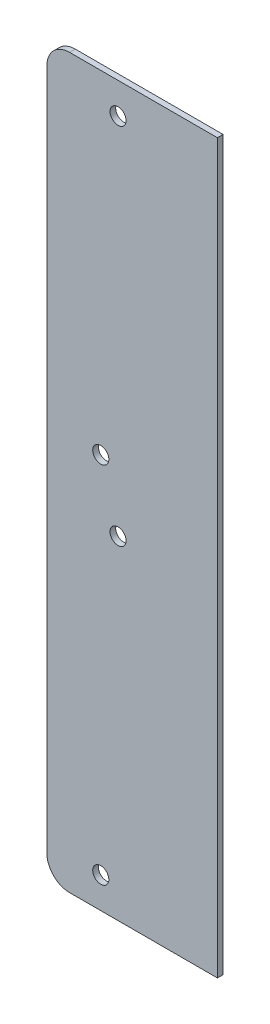
ISO-10303-21;
HEADER;
FILE_DESCRIPTION(('STEP AP214'),'2;1');
FILE_NAME('part.step','',(''),(''),'','','');
FILE_SCHEMA(('AUTOMOTIVE_DESIGN { 1 0 10303 214 1 1 1 1 }'));
ENDSEC;
DATA;
#1=APPLICATION_CONTEXT('core data for automotive mechanical design processes');
#2=APPLICATION_PROTOCOL_DEFINITION('international standard','automotive_design',2000,#1);
#3=PRODUCT_CONTEXT('',#1,'mechanical');
#4=PRODUCT('Part','Part','',(#3));
#5=PRODUCT_RELATED_PRODUCT_CATEGORY('part','',(#4));
#6=PRODUCT_DEFINITION_FORMATION('','',#4);
#7=PRODUCT_DEFINITION_CONTEXT('part definition',#1,'design');
#8=PRODUCT_DEFINITION('design','',#6,#7);
#9=PRODUCT_DEFINITION_SHAPE('','',#8);
#10=(LENGTH_UNIT() NAMED_UNIT(*) SI_UNIT(.MILLI.,.METRE.));
#11=(NAMED_UNIT(*) PLANE_ANGLE_UNIT() SI_UNIT($,.RADIAN.));
#12=(NAMED_UNIT(*) SI_UNIT($,.STERADIAN.) SOLID_ANGLE_UNIT());
#13=UNCERTAINTY_MEASURE_WITH_UNIT(LENGTH_MEASURE(1.E-05),#10,'distance_accuracy_value','');
#14=(GEOMETRIC_REPRESENTATION_CONTEXT(3) GLOBAL_UNCERTAINTY_ASSIGNED_CONTEXT((#13)) GLOBAL_UNIT_ASSIGNED_CONTEXT((#10,
#11,#12)) REPRESENTATION_CONTEXT('',''));
#15=CARTESIAN_POINT('',(0.,0.,0.));
#16=DIRECTION('',(0.,0.,1.));
#17=DIRECTION('',(1.,0.,0.));
#18=AXIS2_PLACEMENT_3D('',#15,#16,#17);
#19=CARTESIAN_POINT('',(-17.4625,50.8,1.5875));
#20=DIRECTION('',(1.,0.,0.));
#21=DIRECTION('',(0.,1.,0.));
#22=AXIS2_PLACEMENT_3D('',#19,#20,#21);
#23=PLANE('',#22);
#24=DIRECTION('',(0.,-1.,0.));
#25=VECTOR('',#24,1.);
#26=CARTESIAN_POINT('',(-17.4625,50.8,0.));
#27=LINE('',#26,#25);
#28=CARTESIAN_POINT('',(-17.4625,146.05,0.));
#29=VERTEX_POINT('',#28);
#30=CARTESIAN_POINT('',(-17.4625,-44.45,0.));
#31=VERTEX_POINT('',#30);
#32=EDGE_CURVE('E104',#29,#31,#27,.T.);
#33=ORIENTED_EDGE('',*,*,#32,.T.);
#34=DIRECTION('',(0.,0.,-1.));
#35=VECTOR('',#34,1.);
#36=CARTESIAN_POINT('',(-17.4625,-44.45,1.5875));
#37=LINE('',#36,#35);
#38=CARTESIAN_POINT('',(-17.4625,-44.45,1.5875));
#39=VERTEX_POINT('',#38);
#40=EDGE_CURVE('E59',#31,#39,#37,.F.);
#41=ORIENTED_EDGE('',*,*,#40,.T.);
#42=DIRECTION('',(0.,-1.,0.));
#43=VECTOR('',#42,1.);
#44=CARTESIAN_POINT('',(-17.4625,50.8,1.5875));
#45=LINE('',#44,#43);
#46=CARTESIAN_POINT('',(-17.4625,146.05,1.5875));
#47=VERTEX_POINT('',#46);
#48=EDGE_CURVE('E103',#47,#39,#45,.T.);
#49=ORIENTED_EDGE('',*,*,#48,.F.);
#50=DIRECTION('',(0.,0.,1.));
#51=VECTOR('',#50,1.);
#52=CARTESIAN_POINT('',(-17.4625,146.05,1.5875));
#53=LINE('',#52,#51);
#54=EDGE_CURVE('E160',#47,#29,#53,.F.);
#55=ORIENTED_EDGE('',*,*,#54,.T.);
#56=EDGE_LOOP('',(#33,#41,#49,#55));
#57=FACE_BOUND('',#56,.T.);
#58=ADVANCED_FACE('F37',(#57),#23,.F.);
#59=CARTESIAN_POINT('',(-17.4625,-50.8,1.5875));
#60=DIRECTION('',(0.,1.,0.));
#61=DIRECTION('',(0.,0.,1.));
#62=AXIS2_PLACEMENT_3D('',#59,#60,#61);
#63=PLANE('',#62);
#64=DIRECTION('',(1.,0.,0.));
#65=VECTOR('',#64,1.);
#66=CARTESIAN_POINT('',(-17.4625,-50.8,1.5875));
#67=LINE('',#66,#65);
#68=CARTESIAN_POINT('',(-11.1125,-50.8,1.5875));
#69=VERTEX_POINT('',#68);
#70=CARTESIAN_POINT('',(30.1625,-50.8,1.5875));
#71=VERTEX_POINT('',#70);
#72=EDGE_CURVE('E152',#69,#71,#67,.T.);
#73=ORIENTED_EDGE('',*,*,#72,.F.);
#74=DIRECTION('',(0.,0.,-1.));
#75=VECTOR('',#74,1.);
#76=CARTESIAN_POINT('',(-11.1125,-50.8,1.5875));
#77=LINE('',#76,#75);
#78=CARTESIAN_POINT('',(-11.1125,-50.8,0.));
#79=VERTEX_POINT('',#78);
#80=EDGE_CURVE('E100',#69,#79,#77,.T.);
#81=ORIENTED_EDGE('',*,*,#80,.T.);
#82=DIRECTION('',(1.,0.,0.));
#83=VECTOR('',#82,1.);
#84=CARTESIAN_POINT('',(-17.4625,-50.8,0.));
#85=LINE('',#84,#83);
#86=CARTESIAN_POINT('',(30.1625,-50.8,0.));
#87=VERTEX_POINT('',#86);
#88=EDGE_CURVE('E93',#79,#87,#85,.T.);
#89=ORIENTED_EDGE('',*,*,#88,.T.);
#90=DIRECTION('',(0.,0.,1.));
#91=VECTOR('',#90,1.);
#92=CARTESIAN_POINT('',(30.1625,-50.8,0.));
#93=LINE('',#92,#91);
#94=EDGE_CURVE('E97',#87,#71,#93,.T.);
#95=ORIENTED_EDGE('',*,*,#94,.T.);
#96=EDGE_LOOP('',(#73,#81,#89,#95));
#97=FACE_BOUND('',#96,.T.);
#98=ADVANCED_FACE('F96',(#97),#63,.F.);
#99=CARTESIAN_POINT('',(0.,0.,1.5875));
#100=DIRECTION('',(0.,0.,1.));
#101=DIRECTION('',(1.,0.,0.));
#102=AXIS2_PLACEMENT_3D('',#99,#100,#101);
#103=PLANE('',#102);
#104=CARTESIAN_POINT('',(-2.413,-42.164,1.5875));
#105=DIRECTION('',(0.,0.,1.));
#106=DIRECTION('',(1.,0.,0.));
#107=AXIS2_PLACEMENT_3D('',#104,#105,#106);
#108=CIRCLE('',#107,2.24999999999999);
#109=CARTESIAN_POINT('',(-0.163000000000011,-42.164,1.5875));
#110=VERTEX_POINT('',#109);
#111=EDGE_CURVE('E133',#110,#110,#108,.T.);
#112=ORIENTED_EDGE('',*,*,#111,.F.);
#113=EDGE_LOOP('',(#112));
#114=FACE_BOUND('',#113,.T.);
#115=CARTESIAN_POINT('',(2.413,42.164,1.5875));
#116=DIRECTION('',(0.,0.,1.));
#117=DIRECTION('',(1.,0.,0.));
#118=AXIS2_PLACEMENT_3D('',#115,#116,#117);
#119=CIRCLE('',#118,2.24999999999999);
#120=CARTESIAN_POINT('',(4.66299999999999,42.164,1.5875));
#121=VERTEX_POINT('',#120);
#122=EDGE_CURVE('E145',#121,#121,#119,.T.);
#123=ORIENTED_EDGE('',*,*,#122,.F.);
#124=EDGE_LOOP('',(#123));
#125=FACE_BOUND('',#124,.T.);
#126=ORIENTED_EDGE('',*,*,#48,.T.);
#127=CARTESIAN_POINT('',(-11.1125,-44.45,1.5875));
#128=DIRECTION('',(0.,0.,1.));
#129=DIRECTION('',(1.,0.,0.));
#130=AXIS2_PLACEMENT_3D('',#127,#128,#129);
#131=CIRCLE('',#130,6.35);
#132=EDGE_CURVE('E45',#39,#69,#131,.T.);
#133=ORIENTED_EDGE('',*,*,#132,.T.);
#134=ORIENTED_EDGE('',*,*,#72,.T.);
#135=DIRECTION('',(0.,1.,0.));
#136=VECTOR('',#135,1.);
#137=CARTESIAN_POINT('',(30.1625,152.4,1.5875));
#138=LINE('',#137,#136);
#139=CARTESIAN_POINT('',(30.1625,152.4,1.5875));
#140=VERTEX_POINT('',#139);
#141=EDGE_CURVE('E112',#71,#140,#138,.T.);
#142=ORIENTED_EDGE('',*,*,#141,.T.);
#143=DIRECTION('',(1.,0.,0.));
#144=VECTOR('',#143,1.);
#145=CARTESIAN_POINT('',(0.,152.4,1.5875));
#146=LINE('',#145,#144);
#147=CARTESIAN_POINT('',(-11.1125,152.4,1.5875));
#148=VERTEX_POINT('',#147);
#149=EDGE_CURVE('E129',#148,#140,#146,.T.);
#150=ORIENTED_EDGE('',*,*,#149,.F.);
#151=CARTESIAN_POINT('',(-11.1125,146.05,1.5875));
#152=DIRECTION('',(0.,0.,1.));
#153=DIRECTION('',(1.,0.,0.));
#154=AXIS2_PLACEMENT_3D('',#151,#152,#153);
#155=CIRCLE('',#154,6.35);
#156=EDGE_CURVE('E52',#148,#47,#155,.T.);
#157=ORIENTED_EDGE('',*,*,#156,.T.);
#158=EDGE_LOOP('',(#126,#133,#134,#142,#150,#157));
#159=FACE_BOUND('',#158,.T.);
#160=CARTESIAN_POINT('',(-2.413,59.4359999999999,1.5875));
#161=DIRECTION('',(0.,0.,1.));
#162=DIRECTION('',(1.,0.,0.));
#163=AXIS2_PLACEMENT_3D('',#160,#161,#162);
#164=CIRCLE('',#163,2.24999999999999);
#165=CARTESIAN_POINT('',(-0.163000000000012,59.4359999999999,1.5875));
#166=VERTEX_POINT('',#165);
#167=EDGE_CURVE('E123',#166,#166,#164,.T.);
#168=ORIENTED_EDGE('',*,*,#167,.F.);
#169=EDGE_LOOP('',(#168));
#170=FACE_BOUND('',#169,.T.);
#171=CARTESIAN_POINT('',(2.413,143.764,1.5875));
#172=DIRECTION('',(0.,0.,1.));
#173=DIRECTION('',(1.,0.,0.));
#174=AXIS2_PLACEMENT_3D('',#171,#172,#173);
#175=CIRCLE('',#174,2.24999999999998);
#176=CARTESIAN_POINT('',(4.66299999999998,143.764,1.5875));
#177=VERTEX_POINT('',#176);
#178=EDGE_CURVE('E136',#177,#177,#175,.T.);
#179=ORIENTED_EDGE('',*,*,#178,.F.);
#180=EDGE_LOOP('',(#179));
#181=FACE_BOUND('',#180,.T.);
#182=ADVANCED_FACE('F165',(#114,#125,#159,#170,#181),#103,.T.);
#183=CARTESIAN_POINT('',(0.,0.,0.));
#184=DIRECTION('',(0.,0.,1.));
#185=DIRECTION('',(1.,0.,0.));
#186=AXIS2_PLACEMENT_3D('',#183,#184,#185);
#187=PLANE('',#186);
#188=CARTESIAN_POINT('',(-2.413,-42.164,0.));
#189=DIRECTION('',(0.,0.,1.));
#190=DIRECTION('',(1.,0.,0.));
#191=AXIS2_PLACEMENT_3D('',#188,#189,#190);
#192=CIRCLE('',#191,2.25);
#193=CARTESIAN_POINT('',(-0.162999999999999,-42.164,0.));
#194=VERTEX_POINT('',#193);
#195=EDGE_CURVE('E142',#194,#194,#192,.T.);
#196=ORIENTED_EDGE('',*,*,#195,.T.);
#197=EDGE_LOOP('',(#196));
#198=FACE_BOUND('',#197,.T.);
#199=CARTESIAN_POINT('',(2.413,42.164,0.));
#200=DIRECTION('',(0.,0.,1.));
#201=DIRECTION('',(1.,0.,0.));
#202=AXIS2_PLACEMENT_3D('',#199,#200,#201);
#203=CIRCLE('',#202,2.25);
#204=CARTESIAN_POINT('',(4.663,42.164,0.));
#205=VERTEX_POINT('',#204);
#206=EDGE_CURVE('E148',#205,#205,#203,.T.);
#207=ORIENTED_EDGE('',*,*,#206,.T.);
#208=EDGE_LOOP('',(#207));
#209=FACE_BOUND('',#208,.T.);
#210=ORIENTED_EDGE('',*,*,#88,.F.);
#211=CARTESIAN_POINT('',(-11.1125,-44.45,0.));
#212=DIRECTION('',(0.,0.,1.));
#213=DIRECTION('',(1.,0.,0.));
#214=AXIS2_PLACEMENT_3D('',#211,#212,#213);
#215=CIRCLE('',#214,6.35);
#216=EDGE_CURVE('E158',#79,#31,#215,.F.);
#217=ORIENTED_EDGE('',*,*,#216,.T.);
#218=ORIENTED_EDGE('',*,*,#32,.F.);
#219=CARTESIAN_POINT('',(-11.1125,146.05,0.));
#220=DIRECTION('',(0.,0.,1.));
#221=DIRECTION('',(1.,0.,0.));
#222=AXIS2_PLACEMENT_3D('',#219,#220,#221);
#223=CIRCLE('',#222,6.35);
#224=CARTESIAN_POINT('',(-11.1125,152.4,0.));
#225=VERTEX_POINT('',#224);
#226=EDGE_CURVE('E156',#29,#225,#223,.F.);
#227=ORIENTED_EDGE('',*,*,#226,.T.);
#228=DIRECTION('',(1.,0.,0.));
#229=VECTOR('',#228,1.);
#230=CARTESIAN_POINT('',(0.,152.4,0.));
#231=LINE('',#230,#229);
#232=CARTESIAN_POINT('',(30.1625,152.4,0.));
#233=VERTEX_POINT('',#232);
#234=EDGE_CURVE('E118',#225,#233,#231,.T.);
#235=ORIENTED_EDGE('',*,*,#234,.T.);
#236=DIRECTION('',(0.,1.,0.));
#237=VECTOR('',#236,1.);
#238=CARTESIAN_POINT('',(30.1625,152.4,0.));
#239=LINE('',#238,#237);
#240=EDGE_CURVE('E110',#87,#233,#239,.T.);
#241=ORIENTED_EDGE('',*,*,#240,.F.);
#242=EDGE_LOOP('',(#210,#217,#218,#227,#235,#241));
#243=FACE_BOUND('',#242,.T.);
#244=CARTESIAN_POINT('',(-2.413,59.4359999999999,0.));
#245=DIRECTION('',(0.,0.,1.));
#246=DIRECTION('',(1.,0.,0.));
#247=AXIS2_PLACEMENT_3D('',#244,#245,#246);
#248=CIRCLE('',#247,2.24999999999999);
#249=CARTESIAN_POINT('',(-0.163000000000012,59.4359999999999,0.));
#250=VERTEX_POINT('',#249);
#251=EDGE_CURVE('E125',#250,#250,#248,.T.);
#252=ORIENTED_EDGE('',*,*,#251,.T.);
#253=EDGE_LOOP('',(#252));
#254=FACE_BOUND('',#253,.T.);
#255=CARTESIAN_POINT('',(2.413,143.764,0.));
#256=DIRECTION('',(0.,0.,1.));
#257=DIRECTION('',(1.,0.,0.));
#258=AXIS2_PLACEMENT_3D('',#255,#256,#257);
#259=CIRCLE('',#258,2.24999999999998);
#260=CARTESIAN_POINT('',(4.66299999999998,143.764,0.));
#261=VERTEX_POINT('',#260);
#262=EDGE_CURVE('E128',#261,#261,#259,.T.);
#263=ORIENTED_EDGE('',*,*,#262,.T.);
#264=EDGE_LOOP('',(#263));
#265=FACE_BOUND('',#264,.T.);
#266=ADVANCED_FACE('F115',(#198,#209,#243,#254,#265),#187,.F.);
#267=CARTESIAN_POINT('',(2.413,42.164,1.5875));
#268=DIRECTION('',(0.,0.,1.));
#269=DIRECTION('',(1.,0.,0.));
#270=AXIS2_PLACEMENT_3D('',#267,#268,#269);
#271=CYLINDRICAL_SURFACE('',#270,2.24999999999999);
#272=ORIENTED_EDGE('',*,*,#206,.F.);
#273=EDGE_LOOP('',(#272));
#274=FACE_BOUND('',#273,.T.);
#275=ORIENTED_EDGE('',*,*,#122,.T.);
#276=EDGE_LOOP('',(#275));
#277=FACE_BOUND('',#276,.T.);
#278=ADVANCED_FACE('F185',(#274,#277),#271,.F.);
#279=CARTESIAN_POINT('',(-2.413,-42.164,1.5875));
#280=DIRECTION('',(0.,0.,1.));
#281=DIRECTION('',(1.,0.,0.));
#282=AXIS2_PLACEMENT_3D('',#279,#280,#281);
#283=CYLINDRICAL_SURFACE('',#282,2.24999999999999);
#284=ORIENTED_EDGE('',*,*,#195,.F.);
#285=EDGE_LOOP('',(#284));
#286=FACE_BOUND('',#285,.T.);
#287=ORIENTED_EDGE('',*,*,#111,.T.);
#288=EDGE_LOOP('',(#287));
#289=FACE_BOUND('',#288,.T.);
#290=ADVANCED_FACE('F176',(#286,#289),#283,.F.);
#291=CARTESIAN_POINT('',(0.,152.4,0.));
#292=DIRECTION('',(0.,-1.,0.));
#293=DIRECTION('',(0.,0.,-1.));
#294=AXIS2_PLACEMENT_3D('',#291,#292,#293);
#295=PLANE('',#294);
#296=ORIENTED_EDGE('',*,*,#234,.F.);
#297=DIRECTION('',(0.,0.,1.));
#298=VECTOR('',#297,1.);
#299=CARTESIAN_POINT('',(-11.1125,152.4,0.));
#300=LINE('',#299,#298);
#301=EDGE_CURVE('E11',#225,#148,#300,.T.);
#302=ORIENTED_EDGE('',*,*,#301,.T.);
#303=ORIENTED_EDGE('',*,*,#149,.T.);
#304=DIRECTION('',(0.,0.,1.));
#305=VECTOR('',#304,1.);
#306=CARTESIAN_POINT('',(30.1625,152.4,0.));
#307=LINE('',#306,#305);
#308=EDGE_CURVE('E113',#233,#140,#307,.T.);
#309=ORIENTED_EDGE('',*,*,#308,.F.);
#310=EDGE_LOOP('',(#296,#302,#303,#309));
#311=FACE_BOUND('',#310,.T.);
#312=ADVANCED_FACE('F172',(#311),#295,.F.);
#313=CARTESIAN_POINT('',(2.413,143.764,0.));
#314=DIRECTION('',(0.,0.,1.));
#315=DIRECTION('',(1.,0.,0.));
#316=AXIS2_PLACEMENT_3D('',#313,#314,#315);
#317=CYLINDRICAL_SURFACE('',#316,2.24999999999998);
#318=ORIENTED_EDGE('',*,*,#262,.F.);
#319=EDGE_LOOP('',(#318));
#320=FACE_BOUND('',#319,.T.);
#321=ORIENTED_EDGE('',*,*,#178,.T.);
#322=EDGE_LOOP('',(#321));
#323=FACE_BOUND('',#322,.T.);
#324=ADVANCED_FACE('F175',(#320,#323),#317,.F.);
#325=CARTESIAN_POINT('',(-2.413,59.4359999999999,0.));
#326=DIRECTION('',(0.,0.,1.));
#327=DIRECTION('',(1.,0.,0.));
#328=AXIS2_PLACEMENT_3D('',#325,#326,#327);
#329=CYLINDRICAL_SURFACE('',#328,2.24999999999999);
#330=ORIENTED_EDGE('',*,*,#251,.F.);
#331=EDGE_LOOP('',(#330));
#332=FACE_BOUND('',#331,.T.);
#333=ORIENTED_EDGE('',*,*,#167,.T.);
#334=EDGE_LOOP('',(#333));
#335=FACE_BOUND('',#334,.T.);
#336=ADVANCED_FACE('F182',(#332,#335),#329,.F.);
#337=CARTESIAN_POINT('',(30.1625,152.4,0.));
#338=DIRECTION('',(1.,0.,0.));
#339=DIRECTION('',(0.,1.,0.));
#340=AXIS2_PLACEMENT_3D('',#337,#338,#339);
#341=PLANE('',#340);
#342=ORIENTED_EDGE('',*,*,#141,.F.);
#343=ORIENTED_EDGE('',*,*,#94,.F.);
#344=ORIENTED_EDGE('',*,*,#240,.T.);
#345=ORIENTED_EDGE('',*,*,#308,.T.);
#346=EDGE_LOOP('',(#342,#343,#344,#345));
#347=FACE_BOUND('',#346,.T.);
#348=ADVANCED_FACE('F108',(#347),#341,.T.);
#349=CARTESIAN_POINT('',(-11.1125,-44.45,1.5875));
#350=DIRECTION('',(0.,0.,-1.));
#351=DIRECTION('',(-1.,0.,0.));
#352=AXIS2_PLACEMENT_3D('',#349,#350,#351);
#353=CYLINDRICAL_SURFACE('',#352,6.35);
#354=ORIENTED_EDGE('',*,*,#132,.F.);
#355=ORIENTED_EDGE('',*,*,#40,.F.);
#356=ORIENTED_EDGE('',*,*,#216,.F.);
#357=ORIENTED_EDGE('',*,*,#80,.F.);
#358=EDGE_LOOP('',(#354,#355,#356,#357));
#359=FACE_BOUND('',#358,.T.);
#360=ADVANCED_FACE('F168',(#359),#353,.T.);
#361=CARTESIAN_POINT('',(-11.1125,146.05,0.));
#362=DIRECTION('',(0.,0.,1.));
#363=DIRECTION('',(1.,0.,0.));
#364=AXIS2_PLACEMENT_3D('',#361,#362,#363);
#365=CYLINDRICAL_SURFACE('',#364,6.35);
#366=ORIENTED_EDGE('',*,*,#226,.F.);
#367=ORIENTED_EDGE('',*,*,#54,.F.);
#368=ORIENTED_EDGE('',*,*,#156,.F.);
#369=ORIENTED_EDGE('',*,*,#301,.F.);
#370=EDGE_LOOP('',(#366,#367,#368,#369));
#371=FACE_BOUND('',#370,.T.);
#372=ADVANCED_FACE('F39',(#371),#365,.T.);
#373=CLOSED_SHELL('',(#58,#98,#182,#266,#278,#290,#312,#324,#336,#348,#360,#372));
#374=MANIFOLD_SOLID_BREP('B2',#373);
#375=ADVANCED_BREP_SHAPE_REPRESENTATION('',(#18,#374),#14);
#376=SHAPE_DEFINITION_REPRESENTATION(#9,#375);
ENDSEC;
END-ISO-10303-21;
